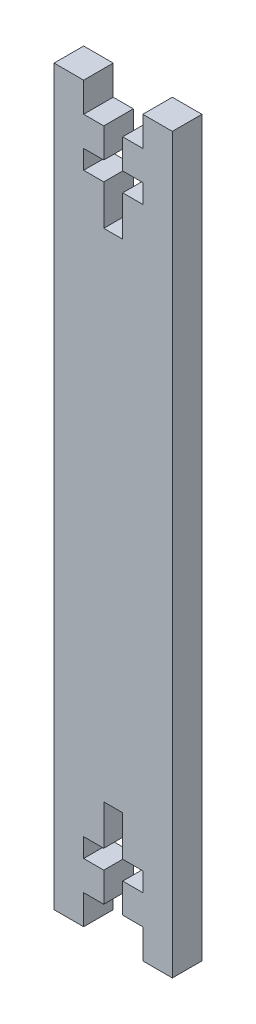
ISO-10303-21;
HEADER;
FILE_DESCRIPTION(('STEP AP214'),'2;1');
FILE_NAME('part.step','',(''),(''),'','','');
FILE_SCHEMA(('AUTOMOTIVE_DESIGN { 1 0 10303 214 1 1 1 1 }'));
ENDSEC;
DATA;
#1=APPLICATION_CONTEXT('core data for automotive mechanical design processes');
#2=APPLICATION_PROTOCOL_DEFINITION('international standard','automotive_design',2000,#1);
#3=PRODUCT_CONTEXT('',#1,'mechanical');
#4=PRODUCT('Part','Part','',(#3));
#5=PRODUCT_RELATED_PRODUCT_CATEGORY('part','',(#4));
#6=PRODUCT_DEFINITION_FORMATION('','',#4);
#7=PRODUCT_DEFINITION_CONTEXT('part definition',#1,'design');
#8=PRODUCT_DEFINITION('design','',#6,#7);
#9=PRODUCT_DEFINITION_SHAPE('','',#8);
#10=(LENGTH_UNIT() NAMED_UNIT(*) SI_UNIT(.MILLI.,.METRE.));
#11=(NAMED_UNIT(*) PLANE_ANGLE_UNIT() SI_UNIT($,.RADIAN.));
#12=(NAMED_UNIT(*) SI_UNIT($,.STERADIAN.) SOLID_ANGLE_UNIT());
#13=UNCERTAINTY_MEASURE_WITH_UNIT(LENGTH_MEASURE(1.E-05),#10,'distance_accuracy_value','');
#14=(GEOMETRIC_REPRESENTATION_CONTEXT(3) GLOBAL_UNCERTAINTY_ASSIGNED_CONTEXT((#13)) GLOBAL_UNIT_ASSIGNED_CONTEXT((#10,
#11,#12)) REPRESENTATION_CONTEXT('',''));
#15=CARTESIAN_POINT('',(0.,0.,0.));
#16=DIRECTION('',(0.,0.,1.));
#17=DIRECTION('',(1.,0.,0.));
#18=AXIS2_PLACEMENT_3D('',#15,#16,#17);
#19=CARTESIAN_POINT('',(12.7,-78.74,6.35));
#20=DIRECTION('',(-1.,0.,0.));
#21=DIRECTION('',(0.,0.,1.));
#22=AXIS2_PLACEMENT_3D('',#19,#20,#21);
#23=PLANE('',#22);
#24=DIRECTION('',(0.,1.,0.));
#25=VECTOR('',#24,1.);
#26=CARTESIAN_POINT('',(12.7,-78.74,0.));
#27=LINE('',#26,#25);
#28=CARTESIAN_POINT('',(12.7,-78.74,0.));
#29=VERTEX_POINT('',#28);
#30=CARTESIAN_POINT('',(12.7,78.74,0.));
#31=VERTEX_POINT('',#30);
#32=EDGE_CURVE('E303',#29,#31,#27,.T.);
#33=ORIENTED_EDGE('',*,*,#32,.T.);
#34=DIRECTION('',(0.,0.,-1.));
#35=VECTOR('',#34,1.);
#36=CARTESIAN_POINT('',(12.7,78.74,6.35));
#37=LINE('',#36,#35);
#38=CARTESIAN_POINT('',(12.7,78.74,6.35));
#39=VERTEX_POINT('',#38);
#40=EDGE_CURVE('E11',#39,#31,#37,.T.);
#41=ORIENTED_EDGE('',*,*,#40,.F.);
#42=DIRECTION('',(0.,1.,0.));
#43=VECTOR('',#42,1.);
#44=CARTESIAN_POINT('',(12.7,-78.74,6.35));
#45=LINE('',#44,#43);
#46=CARTESIAN_POINT('',(12.7,-78.74,6.35));
#47=VERTEX_POINT('',#46);
#48=EDGE_CURVE('E373',#47,#39,#45,.T.);
#49=ORIENTED_EDGE('',*,*,#48,.F.);
#50=DIRECTION('',(0.,0.,-1.));
#51=VECTOR('',#50,1.);
#52=CARTESIAN_POINT('',(12.7,-78.74,6.35));
#53=LINE('',#52,#51);
#54=EDGE_CURVE('E299',#47,#29,#53,.T.);
#55=ORIENTED_EDGE('',*,*,#54,.T.);
#56=EDGE_LOOP('',(#33,#41,#49,#55));
#57=FACE_BOUND('',#56,.T.);
#58=ADVANCED_FACE('F39',(#57),#23,.F.);
#59=CARTESIAN_POINT('',(6.35,78.74,6.35));
#60=DIRECTION('',(0.,-1.,0.));
#61=DIRECTION('',(0.,0.,-1.));
#62=AXIS2_PLACEMENT_3D('',#59,#60,#61);
#63=PLANE('',#62);
#64=DIRECTION('',(-1.,0.,0.));
#65=VECTOR('',#64,1.);
#66=CARTESIAN_POINT('',(6.35,78.74,0.));
#67=LINE('',#66,#65);
#68=CARTESIAN_POINT('',(6.35,78.74,0.));
#69=VERTEX_POINT('',#68);
#70=EDGE_CURVE('E306',#31,#69,#67,.T.);
#71=ORIENTED_EDGE('',*,*,#70,.T.);
#72=DIRECTION('',(0.,0.,-1.));
#73=VECTOR('',#72,1.);
#74=CARTESIAN_POINT('',(6.35,78.74,6.35));
#75=LINE('',#74,#73);
#76=CARTESIAN_POINT('',(6.35,78.74,6.35));
#77=VERTEX_POINT('',#76);
#78=EDGE_CURVE('E47',#77,#69,#75,.T.);
#79=ORIENTED_EDGE('',*,*,#78,.F.);
#80=DIRECTION('',(-1.,0.,0.));
#81=VECTOR('',#80,1.);
#82=CARTESIAN_POINT('',(6.35,78.74,6.35));
#83=LINE('',#82,#81);
#84=EDGE_CURVE('E182',#39,#77,#83,.T.);
#85=ORIENTED_EDGE('',*,*,#84,.F.);
#86=ORIENTED_EDGE('',*,*,#40,.T.);
#87=EDGE_LOOP('',(#71,#79,#85,#86));
#88=FACE_BOUND('',#87,.T.);
#89=ADVANCED_FACE('F571',(#88),#63,.F.);
#90=CARTESIAN_POINT('',(6.35,78.74,6.35));
#91=DIRECTION('',(1.,0.,0.));
#92=DIRECTION('',(0.,0.,-1.));
#93=AXIS2_PLACEMENT_3D('',#90,#91,#92);
#94=PLANE('',#93);
#95=DIRECTION('',(0.,-1.,0.));
#96=VECTOR('',#95,1.);
#97=CARTESIAN_POINT('',(6.35,78.74,0.));
#98=LINE('',#97,#96);
#99=CARTESIAN_POINT('',(6.35,72.39,0.));
#100=VERTEX_POINT('',#99);
#101=EDGE_CURVE('E308',#69,#100,#98,.T.);
#102=ORIENTED_EDGE('',*,*,#101,.T.);
#103=DIRECTION('',(0.,0.,-1.));
#104=VECTOR('',#103,1.);
#105=CARTESIAN_POINT('',(6.35,72.39,6.35));
#106=LINE('',#105,#104);
#107=CARTESIAN_POINT('',(6.35,72.39,6.35));
#108=VERTEX_POINT('',#107);
#109=EDGE_CURVE('E464',#108,#100,#106,.T.);
#110=ORIENTED_EDGE('',*,*,#109,.F.);
#111=DIRECTION('',(0.,-1.,0.));
#112=VECTOR('',#111,1.);
#113=CARTESIAN_POINT('',(6.35,78.74,6.35));
#114=LINE('',#113,#112);
#115=EDGE_CURVE('E472',#77,#108,#114,.T.);
#116=ORIENTED_EDGE('',*,*,#115,.F.);
#117=ORIENTED_EDGE('',*,*,#78,.T.);
#118=EDGE_LOOP('',(#102,#110,#116,#117));
#119=FACE_BOUND('',#118,.T.);
#120=ADVANCED_FACE('F470',(#119),#94,.F.);
#121=CARTESIAN_POINT('',(2.032,72.39,6.35));
#122=DIRECTION('',(0.,-1.,0.));
#123=DIRECTION('',(0.,0.,-1.));
#124=AXIS2_PLACEMENT_3D('',#121,#122,#123);
#125=PLANE('',#124);
#126=DIRECTION('',(-1.,0.,0.));
#127=VECTOR('',#126,1.);
#128=CARTESIAN_POINT('',(2.032,72.39,0.));
#129=LINE('',#128,#127);
#130=CARTESIAN_POINT('',(2.032,72.39,0.));
#131=VERTEX_POINT('',#130);
#132=EDGE_CURVE('E310',#100,#131,#129,.T.);
#133=ORIENTED_EDGE('',*,*,#132,.T.);
#134=DIRECTION('',(0.,0.,-1.));
#135=VECTOR('',#134,1.);
#136=CARTESIAN_POINT('',(2.032,72.39,6.35));
#137=LINE('',#136,#135);
#138=CARTESIAN_POINT('',(2.032,72.39,6.35));
#139=VERTEX_POINT('',#138);
#140=EDGE_CURVE('E461',#139,#131,#137,.T.);
#141=ORIENTED_EDGE('',*,*,#140,.F.);
#142=DIRECTION('',(-1.,0.,0.));
#143=VECTOR('',#142,1.);
#144=CARTESIAN_POINT('',(2.032,72.39,6.35));
#145=LINE('',#144,#143);
#146=EDGE_CURVE('E490',#108,#139,#145,.T.);
#147=ORIENTED_EDGE('',*,*,#146,.F.);
#148=ORIENTED_EDGE('',*,*,#109,.T.);
#149=EDGE_LOOP('',(#133,#141,#147,#148));
#150=FACE_BOUND('',#149,.T.);
#151=ADVANCED_FACE('F481',(#150),#125,.F.);
#152=CARTESIAN_POINT('',(2.032,72.39,6.35));
#153=DIRECTION('',(1.,0.,0.));
#154=DIRECTION('',(0.,0.,-1.));
#155=AXIS2_PLACEMENT_3D('',#152,#153,#154);
#156=PLANE('',#155);
#157=DIRECTION('',(0.,-1.,0.));
#158=VECTOR('',#157,1.);
#159=CARTESIAN_POINT('',(2.032,72.39,0.));
#160=LINE('',#159,#158);
#161=CARTESIAN_POINT('',(2.032,66.04,0.));
#162=VERTEX_POINT('',#161);
#163=EDGE_CURVE('E312',#131,#162,#160,.T.);
#164=ORIENTED_EDGE('',*,*,#163,.T.);
#165=DIRECTION('',(0.,0.,-1.));
#166=VECTOR('',#165,1.);
#167=CARTESIAN_POINT('',(2.032,66.04,6.35));
#168=LINE('',#167,#166);
#169=CARTESIAN_POINT('',(2.032,66.04,6.35));
#170=VERTEX_POINT('',#169);
#171=EDGE_CURVE('E458',#170,#162,#168,.T.);
#172=ORIENTED_EDGE('',*,*,#171,.F.);
#173=DIRECTION('',(0.,-1.,0.));
#174=VECTOR('',#173,1.);
#175=CARTESIAN_POINT('',(2.032,72.39,6.35));
#176=LINE('',#175,#174);
#177=EDGE_CURVE('E487',#139,#170,#176,.T.);
#178=ORIENTED_EDGE('',*,*,#177,.F.);
#179=ORIENTED_EDGE('',*,*,#140,.T.);
#180=EDGE_LOOP('',(#164,#172,#178,#179));
#181=FACE_BOUND('',#180,.T.);
#182=ADVANCED_FACE('F485',(#181),#156,.F.);
#183=CARTESIAN_POINT('',(2.032,66.04,6.35));
#184=DIRECTION('',(0.,1.,0.));
#185=DIRECTION('',(0.,0.,1.));
#186=AXIS2_PLACEMENT_3D('',#183,#184,#185);
#187=PLANE('',#186);
#188=DIRECTION('',(1.,0.,0.));
#189=VECTOR('',#188,1.);
#190=CARTESIAN_POINT('',(2.032,66.04,0.));
#191=LINE('',#190,#189);
#192=CARTESIAN_POINT('',(6.35,66.04,0.));
#193=VERTEX_POINT('',#192);
#194=EDGE_CURVE('E314',#162,#193,#191,.T.);
#195=ORIENTED_EDGE('',*,*,#194,.T.);
#196=DIRECTION('',(0.,0.,-1.));
#197=VECTOR('',#196,1.);
#198=CARTESIAN_POINT('',(6.35,66.04,6.35));
#199=LINE('',#198,#197);
#200=CARTESIAN_POINT('',(6.35,66.04,6.35));
#201=VERTEX_POINT('',#200);
#202=EDGE_CURVE('E455',#201,#193,#199,.T.);
#203=ORIENTED_EDGE('',*,*,#202,.F.);
#204=DIRECTION('',(1.,0.,0.));
#205=VECTOR('',#204,1.);
#206=CARTESIAN_POINT('',(2.032,66.04,6.35));
#207=LINE('',#206,#205);
#208=EDGE_CURVE('E489',#170,#201,#207,.T.);
#209=ORIENTED_EDGE('',*,*,#208,.F.);
#210=ORIENTED_EDGE('',*,*,#171,.T.);
#211=EDGE_LOOP('',(#195,#203,#209,#210));
#212=FACE_BOUND('',#211,.T.);
#213=ADVANCED_FACE('F584',(#212),#187,.F.);
#214=CARTESIAN_POINT('',(6.35,66.04,6.35));
#215=DIRECTION('',(1.,0.,0.));
#216=DIRECTION('',(0.,1.,0.));
#217=AXIS2_PLACEMENT_3D('',#214,#215,#216);
#218=PLANE('',#217);
#219=DIRECTION('',(0.,-1.,0.));
#220=VECTOR('',#219,1.);
#221=CARTESIAN_POINT('',(6.35,66.04,0.));
#222=LINE('',#221,#220);
#223=CARTESIAN_POINT('',(6.35,61.976,0.));
#224=VERTEX_POINT('',#223);
#225=EDGE_CURVE('E316',#193,#224,#222,.T.);
#226=ORIENTED_EDGE('',*,*,#225,.T.);
#227=DIRECTION('',(0.,0.,-1.));
#228=VECTOR('',#227,1.);
#229=CARTESIAN_POINT('',(6.35,61.976,6.35));
#230=LINE('',#229,#228);
#231=CARTESIAN_POINT('',(6.35,61.976,6.35));
#232=VERTEX_POINT('',#231);
#233=EDGE_CURVE('E452',#232,#224,#230,.T.);
#234=ORIENTED_EDGE('',*,*,#233,.F.);
#235=DIRECTION('',(0.,-1.,0.));
#236=VECTOR('',#235,1.);
#237=CARTESIAN_POINT('',(6.35,66.04,6.35));
#238=LINE('',#237,#236);
#239=EDGE_CURVE('E492',#201,#232,#238,.T.);
#240=ORIENTED_EDGE('',*,*,#239,.F.);
#241=ORIENTED_EDGE('',*,*,#202,.T.);
#242=EDGE_LOOP('',(#226,#234,#240,#241));
#243=FACE_BOUND('',#242,.T.);
#244=ADVANCED_FACE('F587',(#243),#218,.F.);
#245=CARTESIAN_POINT('',(2.032,61.976,6.35));
#246=DIRECTION('',(0.,-1.,0.));
#247=DIRECTION('',(0.,0.,-1.));
#248=AXIS2_PLACEMENT_3D('',#245,#246,#247);
#249=PLANE('',#248);
#250=DIRECTION('',(-1.,0.,0.));
#251=VECTOR('',#250,1.);
#252=CARTESIAN_POINT('',(2.032,61.976,0.));
#253=LINE('',#252,#251);
#254=CARTESIAN_POINT('',(2.032,61.976,0.));
#255=VERTEX_POINT('',#254);
#256=EDGE_CURVE('E318',#224,#255,#253,.T.);
#257=ORIENTED_EDGE('',*,*,#256,.T.);
#258=DIRECTION('',(0.,0.,-1.));
#259=VECTOR('',#258,1.);
#260=CARTESIAN_POINT('',(2.032,61.976,6.35));
#261=LINE('',#260,#259);
#262=CARTESIAN_POINT('',(2.032,61.976,6.35));
#263=VERTEX_POINT('',#262);
#264=EDGE_CURVE('E449',#263,#255,#261,.T.);
#265=ORIENTED_EDGE('',*,*,#264,.F.);
#266=DIRECTION('',(-1.,0.,0.));
#267=VECTOR('',#266,1.);
#268=CARTESIAN_POINT('',(2.032,61.976,6.35));
#269=LINE('',#268,#267);
#270=EDGE_CURVE('E498',#232,#263,#269,.T.);
#271=ORIENTED_EDGE('',*,*,#270,.F.);
#272=ORIENTED_EDGE('',*,*,#233,.T.);
#273=EDGE_LOOP('',(#257,#265,#271,#272));
#274=FACE_BOUND('',#273,.T.);
#275=ADVANCED_FACE('F591',(#274),#249,.F.);
#276=CARTESIAN_POINT('',(2.032,61.976,6.35));
#277=DIRECTION('',(1.,0.,0.));
#278=DIRECTION('',(0.,1.,0.));
#279=AXIS2_PLACEMENT_3D('',#276,#277,#278);
#280=PLANE('',#279);
#281=DIRECTION('',(0.,-1.,0.));
#282=VECTOR('',#281,1.);
#283=CARTESIAN_POINT('',(2.032,61.976,0.));
#284=LINE('',#283,#282);
#285=CARTESIAN_POINT('',(2.032,53.34,0.));
#286=VERTEX_POINT('',#285);
#287=EDGE_CURVE('E320',#255,#286,#284,.T.);
#288=ORIENTED_EDGE('',*,*,#287,.T.);
#289=DIRECTION('',(0.,0.,-1.));
#290=VECTOR('',#289,1.);
#291=CARTESIAN_POINT('',(2.032,53.34,6.35));
#292=LINE('',#291,#290);
#293=CARTESIAN_POINT('',(2.032,53.34,6.35));
#294=VERTEX_POINT('',#293);
#295=EDGE_CURVE('E446',#294,#286,#292,.T.);
#296=ORIENTED_EDGE('',*,*,#295,.F.);
#297=DIRECTION('',(0.,-1.,0.));
#298=VECTOR('',#297,1.);
#299=CARTESIAN_POINT('',(2.032,61.976,6.35));
#300=LINE('',#299,#298);
#301=EDGE_CURVE('E500',#263,#294,#300,.T.);
#302=ORIENTED_EDGE('',*,*,#301,.F.);
#303=ORIENTED_EDGE('',*,*,#264,.T.);
#304=EDGE_LOOP('',(#288,#296,#302,#303));
#305=FACE_BOUND('',#304,.T.);
#306=ADVANCED_FACE('F595',(#305),#280,.F.);
#307=CARTESIAN_POINT('',(-2.032,53.34,6.35));
#308=DIRECTION('',(0.,-1.,0.));
#309=DIRECTION('',(0.,0.,-1.));
#310=AXIS2_PLACEMENT_3D('',#307,#308,#309);
#311=PLANE('',#310);
#312=DIRECTION('',(-1.,0.,0.));
#313=VECTOR('',#312,1.);
#314=CARTESIAN_POINT('',(-2.032,53.34,0.));
#315=LINE('',#314,#313);
#316=CARTESIAN_POINT('',(-2.032,53.34,0.));
#317=VERTEX_POINT('',#316);
#318=EDGE_CURVE('E322',#286,#317,#315,.T.);
#319=ORIENTED_EDGE('',*,*,#318,.T.);
#320=DIRECTION('',(0.,0.,-1.));
#321=VECTOR('',#320,1.);
#322=CARTESIAN_POINT('',(-2.032,53.34,6.35));
#323=LINE('',#322,#321);
#324=CARTESIAN_POINT('',(-2.032,53.34,6.35));
#325=VERTEX_POINT('',#324);
#326=EDGE_CURVE('E443',#325,#317,#323,.T.);
#327=ORIENTED_EDGE('',*,*,#326,.F.);
#328=DIRECTION('',(-1.,0.,0.));
#329=VECTOR('',#328,1.);
#330=CARTESIAN_POINT('',(-2.032,53.34,6.35));
#331=LINE('',#330,#329);
#332=EDGE_CURVE('E502',#294,#325,#331,.T.);
#333=ORIENTED_EDGE('',*,*,#332,.F.);
#334=ORIENTED_EDGE('',*,*,#295,.T.);
#335=EDGE_LOOP('',(#319,#327,#333,#334));
#336=FACE_BOUND('',#335,.T.);
#337=ADVANCED_FACE('F599',(#336),#311,.F.);
#338=CARTESIAN_POINT('',(-2.032,61.976,6.35));
#339=DIRECTION('',(-1.,0.,0.));
#340=DIRECTION('',(0.,0.,1.));
#341=AXIS2_PLACEMENT_3D('',#338,#339,#340);
#342=PLANE('',#341);
#343=DIRECTION('',(0.,1.,0.));
#344=VECTOR('',#343,1.);
#345=CARTESIAN_POINT('',(-2.032,61.976,0.));
#346=LINE('',#345,#344);
#347=CARTESIAN_POINT('',(-2.032,61.976,0.));
#348=VERTEX_POINT('',#347);
#349=EDGE_CURVE('E324',#317,#348,#346,.T.);
#350=ORIENTED_EDGE('',*,*,#349,.T.);
#351=DIRECTION('',(0.,0.,-1.));
#352=VECTOR('',#351,1.);
#353=CARTESIAN_POINT('',(-2.032,61.976,6.35));
#354=LINE('',#353,#352);
#355=CARTESIAN_POINT('',(-2.032,61.976,6.35));
#356=VERTEX_POINT('',#355);
#357=EDGE_CURVE('E440',#356,#348,#354,.T.);
#358=ORIENTED_EDGE('',*,*,#357,.F.);
#359=DIRECTION('',(0.,1.,0.));
#360=VECTOR('',#359,1.);
#361=CARTESIAN_POINT('',(-2.032,61.976,6.35));
#362=LINE('',#361,#360);
#363=EDGE_CURVE('E504',#325,#356,#362,.T.);
#364=ORIENTED_EDGE('',*,*,#363,.F.);
#365=ORIENTED_EDGE('',*,*,#326,.T.);
#366=EDGE_LOOP('',(#350,#358,#364,#365));
#367=FACE_BOUND('',#366,.T.);
#368=ADVANCED_FACE('F603',(#367),#342,.F.);
#369=CARTESIAN_POINT('',(-2.032,61.976,6.35));
#370=DIRECTION('',(0.,-1.,0.));
#371=DIRECTION('',(0.,0.,-1.));
#372=AXIS2_PLACEMENT_3D('',#369,#370,#371);
#373=PLANE('',#372);
#374=DIRECTION('',(-1.,0.,0.));
#375=VECTOR('',#374,1.);
#376=CARTESIAN_POINT('',(-2.032,61.976,0.));
#377=LINE('',#376,#375);
#378=CARTESIAN_POINT('',(-6.35,61.976,0.));
#379=VERTEX_POINT('',#378);
#380=EDGE_CURVE('E326',#348,#379,#377,.T.);
#381=ORIENTED_EDGE('',*,*,#380,.T.);
#382=DIRECTION('',(0.,0.,-1.));
#383=VECTOR('',#382,1.);
#384=CARTESIAN_POINT('',(-6.35,61.976,6.35));
#385=LINE('',#384,#383);
#386=CARTESIAN_POINT('',(-6.35,61.976,6.35));
#387=VERTEX_POINT('',#386);
#388=EDGE_CURVE('E437',#387,#379,#385,.T.);
#389=ORIENTED_EDGE('',*,*,#388,.F.);
#390=DIRECTION('',(-1.,0.,0.));
#391=VECTOR('',#390,1.);
#392=CARTESIAN_POINT('',(-2.032,61.976,6.35));
#393=LINE('',#392,#391);
#394=EDGE_CURVE('E506',#356,#387,#393,.T.);
#395=ORIENTED_EDGE('',*,*,#394,.F.);
#396=ORIENTED_EDGE('',*,*,#357,.T.);
#397=EDGE_LOOP('',(#381,#389,#395,#396));
#398=FACE_BOUND('',#397,.T.);
#399=ADVANCED_FACE('F607',(#398),#373,.F.);
#400=CARTESIAN_POINT('',(-6.35,66.04,6.35));
#401=DIRECTION('',(-1.,0.,0.));
#402=DIRECTION('',(0.,-1.,0.));
#403=AXIS2_PLACEMENT_3D('',#400,#401,#402);
#404=PLANE('',#403);
#405=DIRECTION('',(0.,1.,0.));
#406=VECTOR('',#405,1.);
#407=CARTESIAN_POINT('',(-6.35,66.04,0.));
#408=LINE('',#407,#406);
#409=CARTESIAN_POINT('',(-6.35,66.04,0.));
#410=VERTEX_POINT('',#409);
#411=EDGE_CURVE('E328',#379,#410,#408,.T.);
#412=ORIENTED_EDGE('',*,*,#411,.T.);
#413=DIRECTION('',(0.,0.,-1.));
#414=VECTOR('',#413,1.);
#415=CARTESIAN_POINT('',(-6.35,66.04,6.35));
#416=LINE('',#415,#414);
#417=CARTESIAN_POINT('',(-6.35,66.04,6.35));
#418=VERTEX_POINT('',#417);
#419=EDGE_CURVE('E434',#418,#410,#416,.T.);
#420=ORIENTED_EDGE('',*,*,#419,.F.);
#421=DIRECTION('',(0.,1.,0.));
#422=VECTOR('',#421,1.);
#423=CARTESIAN_POINT('',(-6.35,66.04,6.35));
#424=LINE('',#423,#422);
#425=EDGE_CURVE('E508',#387,#418,#424,.T.);
#426=ORIENTED_EDGE('',*,*,#425,.F.);
#427=ORIENTED_EDGE('',*,*,#388,.T.);
#428=EDGE_LOOP('',(#412,#420,#426,#427));
#429=FACE_BOUND('',#428,.T.);
#430=ADVANCED_FACE('F611',(#429),#404,.F.);
#431=CARTESIAN_POINT('',(-2.032,66.04,6.35));
#432=DIRECTION('',(0.,1.,0.));
#433=DIRECTION('',(0.,0.,1.));
#434=AXIS2_PLACEMENT_3D('',#431,#432,#433);
#435=PLANE('',#434);
#436=DIRECTION('',(1.,0.,0.));
#437=VECTOR('',#436,1.);
#438=CARTESIAN_POINT('',(-2.032,66.04,0.));
#439=LINE('',#438,#437);
#440=CARTESIAN_POINT('',(-2.032,66.04,0.));
#441=VERTEX_POINT('',#440);
#442=EDGE_CURVE('E330',#410,#441,#439,.T.);
#443=ORIENTED_EDGE('',*,*,#442,.T.);
#444=DIRECTION('',(0.,0.,-1.));
#445=VECTOR('',#444,1.);
#446=CARTESIAN_POINT('',(-2.032,66.04,6.35));
#447=LINE('',#446,#445);
#448=CARTESIAN_POINT('',(-2.032,66.04,6.35));
#449=VERTEX_POINT('',#448);
#450=EDGE_CURVE('E431',#449,#441,#447,.T.);
#451=ORIENTED_EDGE('',*,*,#450,.F.);
#452=DIRECTION('',(1.,0.,0.));
#453=VECTOR('',#452,1.);
#454=CARTESIAN_POINT('',(-2.032,66.04,6.35));
#455=LINE('',#454,#453);
#456=EDGE_CURVE('E510',#418,#449,#455,.T.);
#457=ORIENTED_EDGE('',*,*,#456,.F.);
#458=ORIENTED_EDGE('',*,*,#419,.T.);
#459=EDGE_LOOP('',(#443,#451,#457,#458));
#460=FACE_BOUND('',#459,.T.);
#461=ADVANCED_FACE('F615',(#460),#435,.F.);
#462=CARTESIAN_POINT('',(-2.032,72.39,6.35));
#463=DIRECTION('',(-1.,0.,0.));
#464=DIRECTION('',(0.,0.,1.));
#465=AXIS2_PLACEMENT_3D('',#462,#463,#464);
#466=PLANE('',#465);
#467=DIRECTION('',(0.,1.,0.));
#468=VECTOR('',#467,1.);
#469=CARTESIAN_POINT('',(-2.032,72.39,0.));
#470=LINE('',#469,#468);
#471=CARTESIAN_POINT('',(-2.032,72.39,0.));
#472=VERTEX_POINT('',#471);
#473=EDGE_CURVE('E332',#441,#472,#470,.T.);
#474=ORIENTED_EDGE('',*,*,#473,.T.);
#475=DIRECTION('',(0.,0.,-1.));
#476=VECTOR('',#475,1.);
#477=CARTESIAN_POINT('',(-2.032,72.39,6.35));
#478=LINE('',#477,#476);
#479=CARTESIAN_POINT('',(-2.032,72.39,6.35));
#480=VERTEX_POINT('',#479);
#481=EDGE_CURVE('E428',#480,#472,#478,.T.);
#482=ORIENTED_EDGE('',*,*,#481,.F.);
#483=DIRECTION('',(0.,1.,0.));
#484=VECTOR('',#483,1.);
#485=CARTESIAN_POINT('',(-2.032,72.39,6.35));
#486=LINE('',#485,#484);
#487=EDGE_CURVE('E512',#449,#480,#486,.T.);
#488=ORIENTED_EDGE('',*,*,#487,.F.);
#489=ORIENTED_EDGE('',*,*,#450,.T.);
#490=EDGE_LOOP('',(#474,#482,#488,#489));
#491=FACE_BOUND('',#490,.T.);
#492=ADVANCED_FACE('F619',(#491),#466,.F.);
#493=CARTESIAN_POINT('',(-6.35,72.39,6.35));
#494=DIRECTION('',(0.,-1.,0.));
#495=DIRECTION('',(0.,0.,-1.));
#496=AXIS2_PLACEMENT_3D('',#493,#494,#495);
#497=PLANE('',#496);
#498=DIRECTION('',(-1.,0.,0.));
#499=VECTOR('',#498,1.);
#500=CARTESIAN_POINT('',(-6.35,72.39,0.));
#501=LINE('',#500,#499);
#502=CARTESIAN_POINT('',(-6.35,72.39,0.));
#503=VERTEX_POINT('',#502);
#504=EDGE_CURVE('E334',#472,#503,#501,.T.);
#505=ORIENTED_EDGE('',*,*,#504,.T.);
#506=DIRECTION('',(0.,0.,-1.));
#507=VECTOR('',#506,1.);
#508=CARTESIAN_POINT('',(-6.35,72.39,6.35));
#509=LINE('',#508,#507);
#510=CARTESIAN_POINT('',(-6.35,72.39,6.35));
#511=VERTEX_POINT('',#510);
#512=EDGE_CURVE('E425',#511,#503,#509,.T.);
#513=ORIENTED_EDGE('',*,*,#512,.F.);
#514=DIRECTION('',(-1.,0.,0.));
#515=VECTOR('',#514,1.);
#516=CARTESIAN_POINT('',(-6.35,72.39,6.35));
#517=LINE('',#516,#515);
#518=EDGE_CURVE('E514',#480,#511,#517,.T.);
#519=ORIENTED_EDGE('',*,*,#518,.F.);
#520=ORIENTED_EDGE('',*,*,#481,.T.);
#521=EDGE_LOOP('',(#505,#513,#519,#520));
#522=FACE_BOUND('',#521,.T.);
#523=ADVANCED_FACE('F623',(#522),#497,.F.);
#524=CARTESIAN_POINT('',(-6.35,78.74,6.35));
#525=DIRECTION('',(-1.,0.,0.));
#526=DIRECTION('',(0.,0.,1.));
#527=AXIS2_PLACEMENT_3D('',#524,#525,#526);
#528=PLANE('',#527);
#529=DIRECTION('',(0.,1.,0.));
#530=VECTOR('',#529,1.);
#531=CARTESIAN_POINT('',(-6.35,78.74,0.));
#532=LINE('',#531,#530);
#533=CARTESIAN_POINT('',(-6.35,78.74,0.));
#534=VERTEX_POINT('',#533);
#535=EDGE_CURVE('E336',#503,#534,#532,.T.);
#536=ORIENTED_EDGE('',*,*,#535,.T.);
#537=DIRECTION('',(0.,0.,-1.));
#538=VECTOR('',#537,1.);
#539=CARTESIAN_POINT('',(-6.35,78.74,6.35));
#540=LINE('',#539,#538);
#541=CARTESIAN_POINT('',(-6.35,78.74,6.35));
#542=VERTEX_POINT('',#541);
#543=EDGE_CURVE('E422',#542,#534,#540,.T.);
#544=ORIENTED_EDGE('',*,*,#543,.F.);
#545=DIRECTION('',(0.,1.,0.));
#546=VECTOR('',#545,1.);
#547=CARTESIAN_POINT('',(-6.35,78.74,6.35));
#548=LINE('',#547,#546);
#549=EDGE_CURVE('E516',#511,#542,#548,.T.);
#550=ORIENTED_EDGE('',*,*,#549,.F.);
#551=ORIENTED_EDGE('',*,*,#512,.T.);
#552=EDGE_LOOP('',(#536,#544,#550,#551));
#553=FACE_BOUND('',#552,.T.);
#554=ADVANCED_FACE('F627',(#553),#528,.F.);
#555=CARTESIAN_POINT('',(-12.7,78.74,6.35));
#556=DIRECTION('',(0.,-1.,0.));
#557=DIRECTION('',(0.,0.,-1.));
#558=AXIS2_PLACEMENT_3D('',#555,#556,#557);
#559=PLANE('',#558);
#560=DIRECTION('',(-1.,0.,0.));
#561=VECTOR('',#560,1.);
#562=CARTESIAN_POINT('',(-12.7,78.74,0.));
#563=LINE('',#562,#561);
#564=CARTESIAN_POINT('',(-12.7,78.74,0.));
#565=VERTEX_POINT('',#564);
#566=EDGE_CURVE('E338',#534,#565,#563,.T.);
#567=ORIENTED_EDGE('',*,*,#566,.T.);
#568=DIRECTION('',(0.,0.,-1.));
#569=VECTOR('',#568,1.);
#570=CARTESIAN_POINT('',(-12.7,78.74,6.35));
#571=LINE('',#570,#569);
#572=CARTESIAN_POINT('',(-12.7,78.74,6.35));
#573=VERTEX_POINT('',#572);
#574=EDGE_CURVE('E419',#573,#565,#571,.T.);
#575=ORIENTED_EDGE('',*,*,#574,.F.);
#576=DIRECTION('',(-1.,0.,0.));
#577=VECTOR('',#576,1.);
#578=CARTESIAN_POINT('',(-12.7,78.74,6.35));
#579=LINE('',#578,#577);
#580=EDGE_CURVE('E518',#542,#573,#579,.T.);
#581=ORIENTED_EDGE('',*,*,#580,.F.);
#582=ORIENTED_EDGE('',*,*,#543,.T.);
#583=EDGE_LOOP('',(#567,#575,#581,#582));
#584=FACE_BOUND('',#583,.T.);
#585=ADVANCED_FACE('F631',(#584),#559,.F.);
#586=CARTESIAN_POINT('',(-12.7,-78.74,6.35));
#587=DIRECTION('',(1.,0.,0.));
#588=DIRECTION('',(0.,0.,-1.));
#589=AXIS2_PLACEMENT_3D('',#586,#587,#588);
#590=PLANE('',#589);
#591=DIRECTION('',(0.,-1.,0.));
#592=VECTOR('',#591,1.);
#593=CARTESIAN_POINT('',(-12.7,-78.74,0.));
#594=LINE('',#593,#592);
#595=CARTESIAN_POINT('',(-12.7,-78.74,0.));
#596=VERTEX_POINT('',#595);
#597=EDGE_CURVE('E340',#565,#596,#594,.T.);
#598=ORIENTED_EDGE('',*,*,#597,.T.);
#599=DIRECTION('',(0.,0.,-1.));
#600=VECTOR('',#599,1.);
#601=CARTESIAN_POINT('',(-12.7,-78.74,6.35));
#602=LINE('',#601,#600);
#603=CARTESIAN_POINT('',(-12.7,-78.74,6.35));
#604=VERTEX_POINT('',#603);
#605=EDGE_CURVE('E416',#604,#596,#602,.T.);
#606=ORIENTED_EDGE('',*,*,#605,.F.);
#607=DIRECTION('',(0.,-1.,0.));
#608=VECTOR('',#607,1.);
#609=CARTESIAN_POINT('',(-12.7,-78.74,6.35));
#610=LINE('',#609,#608);
#611=EDGE_CURVE('E520',#573,#604,#610,.T.);
#612=ORIENTED_EDGE('',*,*,#611,.F.);
#613=ORIENTED_EDGE('',*,*,#574,.T.);
#614=EDGE_LOOP('',(#598,#606,#612,#613));
#615=FACE_BOUND('',#614,.T.);
#616=ADVANCED_FACE('F635',(#615),#590,.F.);
#617=CARTESIAN_POINT('',(-12.7,-78.74,6.35));
#618=DIRECTION('',(0.,1.,0.));
#619=DIRECTION('',(0.,0.,1.));
#620=AXIS2_PLACEMENT_3D('',#617,#618,#619);
#621=PLANE('',#620);
#622=DIRECTION('',(1.,0.,0.));
#623=VECTOR('',#622,1.);
#624=CARTESIAN_POINT('',(-12.7,-78.74,0.));
#625=LINE('',#624,#623);
#626=CARTESIAN_POINT('',(-6.35,-78.74,0.));
#627=VERTEX_POINT('',#626);
#628=EDGE_CURVE('E342',#596,#627,#625,.T.);
#629=ORIENTED_EDGE('',*,*,#628,.T.);
#630=DIRECTION('',(0.,0.,-1.));
#631=VECTOR('',#630,1.);
#632=CARTESIAN_POINT('',(-6.35,-78.74,6.35));
#633=LINE('',#632,#631);
#634=CARTESIAN_POINT('',(-6.35,-78.74,6.35));
#635=VERTEX_POINT('',#634);
#636=EDGE_CURVE('E413',#635,#627,#633,.T.);
#637=ORIENTED_EDGE('',*,*,#636,.F.);
#638=DIRECTION('',(1.,0.,0.));
#639=VECTOR('',#638,1.);
#640=CARTESIAN_POINT('',(-12.7,-78.74,6.35));
#641=LINE('',#640,#639);
#642=EDGE_CURVE('E522',#604,#635,#641,.T.);
#643=ORIENTED_EDGE('',*,*,#642,.F.);
#644=ORIENTED_EDGE('',*,*,#605,.T.);
#645=EDGE_LOOP('',(#629,#637,#643,#644));
#646=FACE_BOUND('',#645,.T.);
#647=ADVANCED_FACE('F639',(#646),#621,.F.);
#648=CARTESIAN_POINT('',(-6.35,-78.74,6.35));
#649=DIRECTION('',(-1.,0.,0.));
#650=DIRECTION('',(0.,0.,1.));
#651=AXIS2_PLACEMENT_3D('',#648,#649,#650);
#652=PLANE('',#651);
#653=DIRECTION('',(0.,1.,0.));
#654=VECTOR('',#653,1.);
#655=CARTESIAN_POINT('',(-6.35,-78.74,0.));
#656=LINE('',#655,#654);
#657=CARTESIAN_POINT('',(-6.35,-72.39,0.));
#658=VERTEX_POINT('',#657);
#659=EDGE_CURVE('E344',#627,#658,#656,.T.);
#660=ORIENTED_EDGE('',*,*,#659,.T.);
#661=DIRECTION('',(0.,0.,-1.));
#662=VECTOR('',#661,1.);
#663=CARTESIAN_POINT('',(-6.35,-72.39,6.35));
#664=LINE('',#663,#662);
#665=CARTESIAN_POINT('',(-6.35,-72.39,6.35));
#666=VERTEX_POINT('',#665);
#667=EDGE_CURVE('E410',#666,#658,#664,.T.);
#668=ORIENTED_EDGE('',*,*,#667,.F.);
#669=DIRECTION('',(0.,1.,0.));
#670=VECTOR('',#669,1.);
#671=CARTESIAN_POINT('',(-6.35,-78.74,6.35));
#672=LINE('',#671,#670);
#673=EDGE_CURVE('E524',#635,#666,#672,.T.);
#674=ORIENTED_EDGE('',*,*,#673,.F.);
#675=ORIENTED_EDGE('',*,*,#636,.T.);
#676=EDGE_LOOP('',(#660,#668,#674,#675));
#677=FACE_BOUND('',#676,.T.);
#678=ADVANCED_FACE('F643',(#677),#652,.F.);
#679=CARTESIAN_POINT('',(-6.35,-72.39,6.35));
#680=DIRECTION('',(0.,1.,0.));
#681=DIRECTION('',(0.,0.,1.));
#682=AXIS2_PLACEMENT_3D('',#679,#680,#681);
#683=PLANE('',#682);
#684=DIRECTION('',(1.,0.,0.));
#685=VECTOR('',#684,1.);
#686=CARTESIAN_POINT('',(-6.35,-72.39,0.));
#687=LINE('',#686,#685);
#688=CARTESIAN_POINT('',(-2.032,-72.39,0.));
#689=VERTEX_POINT('',#688);
#690=EDGE_CURVE('E346',#658,#689,#687,.T.);
#691=ORIENTED_EDGE('',*,*,#690,.T.);
#692=DIRECTION('',(0.,0.,-1.));
#693=VECTOR('',#692,1.);
#694=CARTESIAN_POINT('',(-2.032,-72.39,6.35));
#695=LINE('',#694,#693);
#696=CARTESIAN_POINT('',(-2.032,-72.39,6.35));
#697=VERTEX_POINT('',#696);
#698=EDGE_CURVE('E407',#697,#689,#695,.T.);
#699=ORIENTED_EDGE('',*,*,#698,.F.);
#700=DIRECTION('',(1.,0.,0.));
#701=VECTOR('',#700,1.);
#702=CARTESIAN_POINT('',(-6.35,-72.39,6.35));
#703=LINE('',#702,#701);
#704=EDGE_CURVE('E526',#666,#697,#703,.T.);
#705=ORIENTED_EDGE('',*,*,#704,.F.);
#706=ORIENTED_EDGE('',*,*,#667,.T.);
#707=EDGE_LOOP('',(#691,#699,#705,#706));
#708=FACE_BOUND('',#707,.T.);
#709=ADVANCED_FACE('F647',(#708),#683,.F.);
#710=CARTESIAN_POINT('',(-2.032,-72.39,6.35));
#711=DIRECTION('',(-1.,0.,0.));
#712=DIRECTION('',(0.,0.,1.));
#713=AXIS2_PLACEMENT_3D('',#710,#711,#712);
#714=PLANE('',#713);
#715=DIRECTION('',(0.,1.,0.));
#716=VECTOR('',#715,1.);
#717=CARTESIAN_POINT('',(-2.032,-72.39,0.));
#718=LINE('',#717,#716);
#719=CARTESIAN_POINT('',(-2.032,-66.04,0.));
#720=VERTEX_POINT('',#719);
#721=EDGE_CURVE('E348',#689,#720,#718,.T.);
#722=ORIENTED_EDGE('',*,*,#721,.T.);
#723=DIRECTION('',(0.,0.,-1.));
#724=VECTOR('',#723,1.);
#725=CARTESIAN_POINT('',(-2.032,-66.04,6.35));
#726=LINE('',#725,#724);
#727=CARTESIAN_POINT('',(-2.032,-66.04,6.35));
#728=VERTEX_POINT('',#727);
#729=EDGE_CURVE('E404',#728,#720,#726,.T.);
#730=ORIENTED_EDGE('',*,*,#729,.F.);
#731=DIRECTION('',(0.,1.,0.));
#732=VECTOR('',#731,1.);
#733=CARTESIAN_POINT('',(-2.032,-72.39,6.35));
#734=LINE('',#733,#732);
#735=EDGE_CURVE('E528',#697,#728,#734,.T.);
#736=ORIENTED_EDGE('',*,*,#735,.F.);
#737=ORIENTED_EDGE('',*,*,#698,.T.);
#738=EDGE_LOOP('',(#722,#730,#736,#737));
#739=FACE_BOUND('',#738,.T.);
#740=ADVANCED_FACE('F651',(#739),#714,.F.);
#741=CARTESIAN_POINT('',(-6.35,-66.04,6.35));
#742=DIRECTION('',(0.,-1.,0.));
#743=DIRECTION('',(0.,0.,-1.));
#744=AXIS2_PLACEMENT_3D('',#741,#742,#743);
#745=PLANE('',#744);
#746=DIRECTION('',(-1.,0.,0.));
#747=VECTOR('',#746,1.);
#748=CARTESIAN_POINT('',(-6.35,-66.04,0.));
#749=LINE('',#748,#747);
#750=CARTESIAN_POINT('',(-6.35,-66.04,0.));
#751=VERTEX_POINT('',#750);
#752=EDGE_CURVE('E350',#720,#751,#749,.T.);
#753=ORIENTED_EDGE('',*,*,#752,.T.);
#754=DIRECTION('',(0.,0.,-1.));
#755=VECTOR('',#754,1.);
#756=CARTESIAN_POINT('',(-6.35,-66.04,6.35));
#757=LINE('',#756,#755);
#758=CARTESIAN_POINT('',(-6.35,-66.04,6.35));
#759=VERTEX_POINT('',#758);
#760=EDGE_CURVE('E401',#759,#751,#757,.T.);
#761=ORIENTED_EDGE('',*,*,#760,.F.);
#762=DIRECTION('',(-1.,0.,0.));
#763=VECTOR('',#762,1.);
#764=CARTESIAN_POINT('',(-6.35,-66.04,6.35));
#765=LINE('',#764,#763);
#766=EDGE_CURVE('E530',#728,#759,#765,.T.);
#767=ORIENTED_EDGE('',*,*,#766,.F.);
#768=ORIENTED_EDGE('',*,*,#729,.T.);
#769=EDGE_LOOP('',(#753,#761,#767,#768));
#770=FACE_BOUND('',#769,.T.);
#771=ADVANCED_FACE('F655',(#770),#745,.F.);
#772=CARTESIAN_POINT('',(-6.35,-66.04,6.35));
#773=DIRECTION('',(-1.,0.,0.));
#774=DIRECTION('',(0.,0.,1.));
#775=AXIS2_PLACEMENT_3D('',#772,#773,#774);
#776=PLANE('',#775);
#777=DIRECTION('',(0.,1.,0.));
#778=VECTOR('',#777,1.);
#779=CARTESIAN_POINT('',(-6.35,-66.04,0.));
#780=LINE('',#779,#778);
#781=CARTESIAN_POINT('',(-6.35,-61.976,0.));
#782=VERTEX_POINT('',#781);
#783=EDGE_CURVE('E352',#751,#782,#780,.T.);
#784=ORIENTED_EDGE('',*,*,#783,.T.);
#785=DIRECTION('',(0.,0.,-1.));
#786=VECTOR('',#785,1.);
#787=CARTESIAN_POINT('',(-6.35,-61.976,6.35));
#788=LINE('',#787,#786);
#789=CARTESIAN_POINT('',(-6.35,-61.976,6.35));
#790=VERTEX_POINT('',#789);
#791=EDGE_CURVE('E398',#790,#782,#788,.T.);
#792=ORIENTED_EDGE('',*,*,#791,.F.);
#793=DIRECTION('',(0.,1.,0.));
#794=VECTOR('',#793,1.);
#795=CARTESIAN_POINT('',(-6.35,-66.04,6.35));
#796=LINE('',#795,#794);
#797=EDGE_CURVE('E532',#759,#790,#796,.T.);
#798=ORIENTED_EDGE('',*,*,#797,.F.);
#799=ORIENTED_EDGE('',*,*,#760,.T.);
#800=EDGE_LOOP('',(#784,#792,#798,#799));
#801=FACE_BOUND('',#800,.T.);
#802=ADVANCED_FACE('F659',(#801),#776,.F.);
#803=CARTESIAN_POINT('',(-6.35,-61.976,6.35));
#804=DIRECTION('',(0.,1.,0.));
#805=DIRECTION('',(0.,0.,1.));
#806=AXIS2_PLACEMENT_3D('',#803,#804,#805);
#807=PLANE('',#806);
#808=DIRECTION('',(1.,0.,0.));
#809=VECTOR('',#808,1.);
#810=CARTESIAN_POINT('',(-6.35,-61.976,0.));
#811=LINE('',#810,#809);
#812=CARTESIAN_POINT('',(-2.032,-61.976,0.));
#813=VERTEX_POINT('',#812);
#814=EDGE_CURVE('E354',#782,#813,#811,.T.);
#815=ORIENTED_EDGE('',*,*,#814,.T.);
#816=DIRECTION('',(0.,0.,-1.));
#817=VECTOR('',#816,1.);
#818=CARTESIAN_POINT('',(-2.032,-61.976,6.35));
#819=LINE('',#818,#817);
#820=CARTESIAN_POINT('',(-2.032,-61.976,6.35));
#821=VERTEX_POINT('',#820);
#822=EDGE_CURVE('E395',#821,#813,#819,.T.);
#823=ORIENTED_EDGE('',*,*,#822,.F.);
#824=DIRECTION('',(1.,0.,0.));
#825=VECTOR('',#824,1.);
#826=CARTESIAN_POINT('',(-6.35,-61.976,6.35));
#827=LINE('',#826,#825);
#828=EDGE_CURVE('E534',#790,#821,#827,.T.);
#829=ORIENTED_EDGE('',*,*,#828,.F.);
#830=ORIENTED_EDGE('',*,*,#791,.T.);
#831=EDGE_LOOP('',(#815,#823,#829,#830));
#832=FACE_BOUND('',#831,.T.);
#833=ADVANCED_FACE('F663',(#832),#807,.F.);
#834=CARTESIAN_POINT('',(-2.032,-61.976,6.35));
#835=DIRECTION('',(-1.,0.,0.));
#836=DIRECTION('',(0.,0.,1.));
#837=AXIS2_PLACEMENT_3D('',#834,#835,#836);
#838=PLANE('',#837);
#839=DIRECTION('',(0.,1.,0.));
#840=VECTOR('',#839,1.);
#841=CARTESIAN_POINT('',(-2.032,-61.976,0.));
#842=LINE('',#841,#840);
#843=CARTESIAN_POINT('',(-2.032,-53.34,0.));
#844=VERTEX_POINT('',#843);
#845=EDGE_CURVE('E356',#813,#844,#842,.T.);
#846=ORIENTED_EDGE('',*,*,#845,.T.);
#847=DIRECTION('',(0.,0.,-1.));
#848=VECTOR('',#847,1.);
#849=CARTESIAN_POINT('',(-2.032,-53.34,6.35));
#850=LINE('',#849,#848);
#851=CARTESIAN_POINT('',(-2.032,-53.34,6.35));
#852=VERTEX_POINT('',#851);
#853=EDGE_CURVE('E392',#852,#844,#850,.T.);
#854=ORIENTED_EDGE('',*,*,#853,.F.);
#855=DIRECTION('',(0.,1.,0.));
#856=VECTOR('',#855,1.);
#857=CARTESIAN_POINT('',(-2.032,-61.976,6.35));
#858=LINE('',#857,#856);
#859=EDGE_CURVE('E536',#821,#852,#858,.T.);
#860=ORIENTED_EDGE('',*,*,#859,.F.);
#861=ORIENTED_EDGE('',*,*,#822,.T.);
#862=EDGE_LOOP('',(#846,#854,#860,#861));
#863=FACE_BOUND('',#862,.T.);
#864=ADVANCED_FACE('F667',(#863),#838,.F.);
#865=CARTESIAN_POINT('',(-2.032,-53.34,6.35));
#866=DIRECTION('',(0.,1.,0.));
#867=DIRECTION('',(0.,0.,1.));
#868=AXIS2_PLACEMENT_3D('',#865,#866,#867);
#869=PLANE('',#868);
#870=DIRECTION('',(1.,0.,0.));
#871=VECTOR('',#870,1.);
#872=CARTESIAN_POINT('',(-2.032,-53.34,0.));
#873=LINE('',#872,#871);
#874=CARTESIAN_POINT('',(2.032,-53.34,0.));
#875=VERTEX_POINT('',#874);
#876=EDGE_CURVE('E358',#844,#875,#873,.T.);
#877=ORIENTED_EDGE('',*,*,#876,.T.);
#878=DIRECTION('',(0.,0.,-1.));
#879=VECTOR('',#878,1.);
#880=CARTESIAN_POINT('',(2.032,-53.34,6.35));
#881=LINE('',#880,#879);
#882=CARTESIAN_POINT('',(2.032,-53.34,6.35));
#883=VERTEX_POINT('',#882);
#884=EDGE_CURVE('E389',#883,#875,#881,.T.);
#885=ORIENTED_EDGE('',*,*,#884,.F.);
#886=DIRECTION('',(1.,0.,0.));
#887=VECTOR('',#886,1.);
#888=CARTESIAN_POINT('',(-2.032,-53.34,6.35));
#889=LINE('',#888,#887);
#890=EDGE_CURVE('E538',#852,#883,#889,.T.);
#891=ORIENTED_EDGE('',*,*,#890,.F.);
#892=ORIENTED_EDGE('',*,*,#853,.T.);
#893=EDGE_LOOP('',(#877,#885,#891,#892));
#894=FACE_BOUND('',#893,.T.);
#895=ADVANCED_FACE('F671',(#894),#869,.F.);
#896=CARTESIAN_POINT('',(2.032,-61.976,6.35));
#897=DIRECTION('',(1.,0.,0.));
#898=DIRECTION('',(0.,1.,0.));
#899=AXIS2_PLACEMENT_3D('',#896,#897,#898);
#900=PLANE('',#899);
#901=DIRECTION('',(0.,-1.,0.));
#902=VECTOR('',#901,1.);
#903=CARTESIAN_POINT('',(2.032,-61.976,0.));
#904=LINE('',#903,#902);
#905=CARTESIAN_POINT('',(2.032,-61.976,0.));
#906=VERTEX_POINT('',#905);
#907=EDGE_CURVE('E360',#875,#906,#904,.T.);
#908=ORIENTED_EDGE('',*,*,#907,.T.);
#909=DIRECTION('',(0.,0.,-1.));
#910=VECTOR('',#909,1.);
#911=CARTESIAN_POINT('',(2.032,-61.976,6.35));
#912=LINE('',#911,#910);
#913=CARTESIAN_POINT('',(2.032,-61.976,6.35));
#914=VERTEX_POINT('',#913);
#915=EDGE_CURVE('E386',#914,#906,#912,.T.);
#916=ORIENTED_EDGE('',*,*,#915,.F.);
#917=DIRECTION('',(0.,-1.,0.));
#918=VECTOR('',#917,1.);
#919=CARTESIAN_POINT('',(2.032,-61.976,6.35));
#920=LINE('',#919,#918);
#921=EDGE_CURVE('E540',#883,#914,#920,.T.);
#922=ORIENTED_EDGE('',*,*,#921,.F.);
#923=ORIENTED_EDGE('',*,*,#884,.T.);
#924=EDGE_LOOP('',(#908,#916,#922,#923));
#925=FACE_BOUND('',#924,.T.);
#926=ADVANCED_FACE('F675',(#925),#900,.F.);
#927=CARTESIAN_POINT('',(2.032,-61.976,6.35));
#928=DIRECTION('',(0.,1.,0.));
#929=DIRECTION('',(0.,0.,1.));
#930=AXIS2_PLACEMENT_3D('',#927,#928,#929);
#931=PLANE('',#930);
#932=DIRECTION('',(1.,0.,0.));
#933=VECTOR('',#932,1.);
#934=CARTESIAN_POINT('',(2.032,-61.976,0.));
#935=LINE('',#934,#933);
#936=CARTESIAN_POINT('',(6.35,-61.976,0.));
#937=VERTEX_POINT('',#936);
#938=EDGE_CURVE('E362',#906,#937,#935,.T.);
#939=ORIENTED_EDGE('',*,*,#938,.T.);
#940=DIRECTION('',(0.,0.,-1.));
#941=VECTOR('',#940,1.);
#942=CARTESIAN_POINT('',(6.35,-61.976,6.35));
#943=LINE('',#942,#941);
#944=CARTESIAN_POINT('',(6.35,-61.976,6.35));
#945=VERTEX_POINT('',#944);
#946=EDGE_CURVE('E383',#945,#937,#943,.T.);
#947=ORIENTED_EDGE('',*,*,#946,.F.);
#948=DIRECTION('',(1.,0.,0.));
#949=VECTOR('',#948,1.);
#950=CARTESIAN_POINT('',(2.032,-61.976,6.35));
#951=LINE('',#950,#949);
#952=EDGE_CURVE('E542',#914,#945,#951,.T.);
#953=ORIENTED_EDGE('',*,*,#952,.F.);
#954=ORIENTED_EDGE('',*,*,#915,.T.);
#955=EDGE_LOOP('',(#939,#947,#953,#954));
#956=FACE_BOUND('',#955,.T.);
#957=ADVANCED_FACE('F679',(#956),#931,.F.);
#958=CARTESIAN_POINT('',(6.35,-66.04,6.35));
#959=DIRECTION('',(1.,0.,0.));
#960=DIRECTION('',(0.,0.,-1.));
#961=AXIS2_PLACEMENT_3D('',#958,#959,#960);
#962=PLANE('',#961);
#963=DIRECTION('',(0.,-1.,0.));
#964=VECTOR('',#963,1.);
#965=CARTESIAN_POINT('',(6.35,-66.04,0.));
#966=LINE('',#965,#964);
#967=CARTESIAN_POINT('',(6.35,-66.04,0.));
#968=VERTEX_POINT('',#967);
#969=EDGE_CURVE('E364',#937,#968,#966,.T.);
#970=ORIENTED_EDGE('',*,*,#969,.T.);
#971=DIRECTION('',(0.,0.,-1.));
#972=VECTOR('',#971,1.);
#973=CARTESIAN_POINT('',(6.35,-66.04,6.35));
#974=LINE('',#973,#972);
#975=CARTESIAN_POINT('',(6.35,-66.04,6.35));
#976=VERTEX_POINT('',#975);
#977=EDGE_CURVE('E380',#976,#968,#974,.T.);
#978=ORIENTED_EDGE('',*,*,#977,.F.);
#979=DIRECTION('',(0.,-1.,0.));
#980=VECTOR('',#979,1.);
#981=CARTESIAN_POINT('',(6.35,-66.04,6.35));
#982=LINE('',#981,#980);
#983=EDGE_CURVE('E544',#945,#976,#982,.T.);
#984=ORIENTED_EDGE('',*,*,#983,.F.);
#985=ORIENTED_EDGE('',*,*,#946,.T.);
#986=EDGE_LOOP('',(#970,#978,#984,#985));
#987=FACE_BOUND('',#986,.T.);
#988=ADVANCED_FACE('F683',(#987),#962,.F.);
#989=CARTESIAN_POINT('',(2.032,-66.04,6.35));
#990=DIRECTION('',(0.,-1.,0.));
#991=DIRECTION('',(0.,0.,-1.));
#992=AXIS2_PLACEMENT_3D('',#989,#990,#991);
#993=PLANE('',#992);
#994=DIRECTION('',(-1.,0.,0.));
#995=VECTOR('',#994,1.);
#996=CARTESIAN_POINT('',(2.032,-66.04,0.));
#997=LINE('',#996,#995);
#998=CARTESIAN_POINT('',(2.032,-66.04,0.));
#999=VERTEX_POINT('',#998);
#1000=EDGE_CURVE('E366',#968,#999,#997,.T.);
#1001=ORIENTED_EDGE('',*,*,#1000,.T.);
#1002=DIRECTION('',(0.,0.,-1.));
#1003=VECTOR('',#1002,1.);
#1004=CARTESIAN_POINT('',(2.032,-66.04,6.35));
#1005=LINE('',#1004,#1003);
#1006=CARTESIAN_POINT('',(2.032,-66.04,6.35));
#1007=VERTEX_POINT('',#1006);
#1008=EDGE_CURVE('E377',#1007,#999,#1005,.T.);
#1009=ORIENTED_EDGE('',*,*,#1008,.F.);
#1010=DIRECTION('',(-1.,0.,0.));
#1011=VECTOR('',#1010,1.);
#1012=CARTESIAN_POINT('',(2.032,-66.04,6.35));
#1013=LINE('',#1012,#1011);
#1014=EDGE_CURVE('E546',#976,#1007,#1013,.T.);
#1015=ORIENTED_EDGE('',*,*,#1014,.F.);
#1016=ORIENTED_EDGE('',*,*,#977,.T.);
#1017=EDGE_LOOP('',(#1001,#1009,#1015,#1016));
#1018=FACE_BOUND('',#1017,.T.);
#1019=ADVANCED_FACE('F552',(#1018),#993,.F.);
#1020=CARTESIAN_POINT('',(2.032,-72.39,6.35));
#1021=DIRECTION('',(1.,0.,0.));
#1022=DIRECTION('',(0.,0.,-1.));
#1023=AXIS2_PLACEMENT_3D('',#1020,#1021,#1022);
#1024=PLANE('',#1023);
#1025=DIRECTION('',(0.,-1.,0.));
#1026=VECTOR('',#1025,1.);
#1027=CARTESIAN_POINT('',(2.032,-72.39,0.));
#1028=LINE('',#1027,#1026);
#1029=CARTESIAN_POINT('',(2.032,-72.39,0.));
#1030=VERTEX_POINT('',#1029);
#1031=EDGE_CURVE('E368',#999,#1030,#1028,.T.);
#1032=ORIENTED_EDGE('',*,*,#1031,.T.);
#1033=DIRECTION('',(0.,0.,-1.));
#1034=VECTOR('',#1033,1.);
#1035=CARTESIAN_POINT('',(2.032,-72.39,6.35));
#1036=LINE('',#1035,#1034);
#1037=CARTESIAN_POINT('',(2.032,-72.39,6.35));
#1038=VERTEX_POINT('',#1037);
#1039=EDGE_CURVE('E294',#1038,#1030,#1036,.T.);
#1040=ORIENTED_EDGE('',*,*,#1039,.F.);
#1041=DIRECTION('',(0.,-1.,0.));
#1042=VECTOR('',#1041,1.);
#1043=CARTESIAN_POINT('',(2.032,-72.39,6.35));
#1044=LINE('',#1043,#1042);
#1045=EDGE_CURVE('E285',#1007,#1038,#1044,.T.);
#1046=ORIENTED_EDGE('',*,*,#1045,.F.);
#1047=ORIENTED_EDGE('',*,*,#1008,.T.);
#1048=EDGE_LOOP('',(#1032,#1040,#1046,#1047));
#1049=FACE_BOUND('',#1048,.T.);
#1050=ADVANCED_FACE('F556',(#1049),#1024,.F.);
#1051=CARTESIAN_POINT('',(2.032,-72.39,6.35));
#1052=DIRECTION('',(0.,1.,0.));
#1053=DIRECTION('',(0.,0.,1.));
#1054=AXIS2_PLACEMENT_3D('',#1051,#1052,#1053);
#1055=PLANE('',#1054);
#1056=DIRECTION('',(1.,0.,0.));
#1057=VECTOR('',#1056,1.);
#1058=CARTESIAN_POINT('',(2.032,-72.39,0.));
#1059=LINE('',#1058,#1057);
#1060=CARTESIAN_POINT('',(6.35,-72.39,0.));
#1061=VERTEX_POINT('',#1060);
#1062=EDGE_CURVE('E293',#1030,#1061,#1059,.T.);
#1063=ORIENTED_EDGE('',*,*,#1062,.T.);
#1064=DIRECTION('',(0.,0.,-1.));
#1065=VECTOR('',#1064,1.);
#1066=CARTESIAN_POINT('',(6.35,-72.39,6.35));
#1067=LINE('',#1066,#1065);
#1068=CARTESIAN_POINT('',(6.35,-72.39,6.35));
#1069=VERTEX_POINT('',#1068);
#1070=EDGE_CURVE('E290',#1069,#1061,#1067,.T.);
#1071=ORIENTED_EDGE('',*,*,#1070,.F.);
#1072=DIRECTION('',(1.,0.,0.));
#1073=VECTOR('',#1072,1.);
#1074=CARTESIAN_POINT('',(2.032,-72.39,6.35));
#1075=LINE('',#1074,#1073);
#1076=EDGE_CURVE('E279',#1038,#1069,#1075,.T.);
#1077=ORIENTED_EDGE('',*,*,#1076,.F.);
#1078=ORIENTED_EDGE('',*,*,#1039,.T.);
#1079=EDGE_LOOP('',(#1063,#1071,#1077,#1078));
#1080=FACE_BOUND('',#1079,.T.);
#1081=ADVANCED_FACE('F291',(#1080),#1055,.F.);
#1082=CARTESIAN_POINT('',(6.35,-78.74,6.35));
#1083=DIRECTION('',(1.,0.,0.));
#1084=DIRECTION('',(0.,1.,0.));
#1085=AXIS2_PLACEMENT_3D('',#1082,#1083,#1084);
#1086=PLANE('',#1085);
#1087=DIRECTION('',(0.,-1.,0.));
#1088=VECTOR('',#1087,1.);
#1089=CARTESIAN_POINT('',(6.35,-78.74,0.));
#1090=LINE('',#1089,#1088);
#1091=CARTESIAN_POINT('',(6.35,-78.74,0.));
#1092=VERTEX_POINT('',#1091);
#1093=EDGE_CURVE('E168',#1061,#1092,#1090,.T.);
#1094=ORIENTED_EDGE('',*,*,#1093,.T.);
#1095=DIRECTION('',(0.,0.,-1.));
#1096=VECTOR('',#1095,1.);
#1097=CARTESIAN_POINT('',(6.35,-78.74,6.35));
#1098=LINE('',#1097,#1096);
#1099=CARTESIAN_POINT('',(6.35,-78.74,6.35));
#1100=VERTEX_POINT('',#1099);
#1101=EDGE_CURVE('E295',#1100,#1092,#1098,.T.);
#1102=ORIENTED_EDGE('',*,*,#1101,.F.);
#1103=DIRECTION('',(0.,-1.,0.));
#1104=VECTOR('',#1103,1.);
#1105=CARTESIAN_POINT('',(6.35,-78.74,6.35));
#1106=LINE('',#1105,#1104);
#1107=EDGE_CURVE('E283',#1069,#1100,#1106,.T.);
#1108=ORIENTED_EDGE('',*,*,#1107,.F.);
#1109=ORIENTED_EDGE('',*,*,#1070,.T.);
#1110=EDGE_LOOP('',(#1094,#1102,#1108,#1109));
#1111=FACE_BOUND('',#1110,.T.);
#1112=ADVANCED_FACE('F297',(#1111),#1086,.F.);
#1113=CARTESIAN_POINT('',(6.35,-78.74,6.35));
#1114=DIRECTION('',(0.,1.,0.));
#1115=DIRECTION('',(0.,0.,1.));
#1116=AXIS2_PLACEMENT_3D('',#1113,#1114,#1115);
#1117=PLANE('',#1116);
#1118=DIRECTION('',(1.,0.,0.));
#1119=VECTOR('',#1118,1.);
#1120=CARTESIAN_POINT('',(6.35,-78.74,0.));
#1121=LINE('',#1120,#1119);
#1122=EDGE_CURVE('E174',#1092,#29,#1121,.T.);
#1123=ORIENTED_EDGE('',*,*,#1122,.T.);
#1124=ORIENTED_EDGE('',*,*,#54,.F.);
#1125=DIRECTION('',(1.,0.,0.));
#1126=VECTOR('',#1125,1.);
#1127=CARTESIAN_POINT('',(6.35,-78.74,6.35));
#1128=LINE('',#1127,#1126);
#1129=EDGE_CURVE('E55',#1100,#47,#1128,.T.);
#1130=ORIENTED_EDGE('',*,*,#1129,.F.);
#1131=ORIENTED_EDGE('',*,*,#1101,.T.);
#1132=EDGE_LOOP('',(#1123,#1124,#1130,#1131));
#1133=FACE_BOUND('',#1132,.T.);
#1134=ADVANCED_FACE('F560',(#1133),#1117,.F.);
#1135=CARTESIAN_POINT('',(0.,0.,6.35));
#1136=DIRECTION('',(0.,0.,-1.));
#1137=DIRECTION('',(-1.,0.,0.));
#1138=AXIS2_PLACEMENT_3D('',#1135,#1136,#1137);
#1139=PLANE('',#1138);
#1140=ORIENTED_EDGE('',*,*,#48,.T.);
#1141=ORIENTED_EDGE('',*,*,#84,.T.);
#1142=ORIENTED_EDGE('',*,*,#115,.T.);
#1143=ORIENTED_EDGE('',*,*,#146,.T.);
#1144=ORIENTED_EDGE('',*,*,#177,.T.);
#1145=ORIENTED_EDGE('',*,*,#208,.T.);
#1146=ORIENTED_EDGE('',*,*,#239,.T.);
#1147=ORIENTED_EDGE('',*,*,#270,.T.);
#1148=ORIENTED_EDGE('',*,*,#301,.T.);
#1149=ORIENTED_EDGE('',*,*,#332,.T.);
#1150=ORIENTED_EDGE('',*,*,#363,.T.);
#1151=ORIENTED_EDGE('',*,*,#394,.T.);
#1152=ORIENTED_EDGE('',*,*,#425,.T.);
#1153=ORIENTED_EDGE('',*,*,#456,.T.);
#1154=ORIENTED_EDGE('',*,*,#487,.T.);
#1155=ORIENTED_EDGE('',*,*,#518,.T.);
#1156=ORIENTED_EDGE('',*,*,#549,.T.);
#1157=ORIENTED_EDGE('',*,*,#580,.T.);
#1158=ORIENTED_EDGE('',*,*,#611,.T.);
#1159=ORIENTED_EDGE('',*,*,#642,.T.);
#1160=ORIENTED_EDGE('',*,*,#673,.T.);
#1161=ORIENTED_EDGE('',*,*,#704,.T.);
#1162=ORIENTED_EDGE('',*,*,#735,.T.);
#1163=ORIENTED_EDGE('',*,*,#766,.T.);
#1164=ORIENTED_EDGE('',*,*,#797,.T.);
#1165=ORIENTED_EDGE('',*,*,#828,.T.);
#1166=ORIENTED_EDGE('',*,*,#859,.T.);
#1167=ORIENTED_EDGE('',*,*,#890,.T.);
#1168=ORIENTED_EDGE('',*,*,#921,.T.);
#1169=ORIENTED_EDGE('',*,*,#952,.T.);
#1170=ORIENTED_EDGE('',*,*,#983,.T.);
#1171=ORIENTED_EDGE('',*,*,#1014,.T.);
#1172=ORIENTED_EDGE('',*,*,#1045,.T.);
#1173=ORIENTED_EDGE('',*,*,#1076,.T.);
#1174=ORIENTED_EDGE('',*,*,#1107,.T.);
#1175=ORIENTED_EDGE('',*,*,#1129,.T.);
#1176=EDGE_LOOP('',(#1140,#1141,#1142,#1143,#1144,#1145,#1146,#1147,#1148,#1149,#1150,#1151,
#1152,#1153,#1154,#1155,#1156,#1157,#1158,#1159,#1160,#1161,#1162,#1163,#1164,#1165,#1166,#1167,
#1168,#1169,#1170,#1171,#1172,#1173,#1174,#1175));
#1177=FACE_BOUND('',#1176,.T.);
#1178=ADVANCED_FACE('F281',(#1177),#1139,.F.);
#1179=CARTESIAN_POINT('',(0.,0.,0.));
#1180=DIRECTION('',(0.,0.,-1.));
#1181=DIRECTION('',(-1.,0.,0.));
#1182=AXIS2_PLACEMENT_3D('',#1179,#1180,#1181);
#1183=PLANE('',#1182);
#1184=ORIENTED_EDGE('',*,*,#32,.F.);
#1185=ORIENTED_EDGE('',*,*,#1122,.F.);
#1186=ORIENTED_EDGE('',*,*,#1093,.F.);
#1187=ORIENTED_EDGE('',*,*,#1062,.F.);
#1188=ORIENTED_EDGE('',*,*,#1031,.F.);
#1189=ORIENTED_EDGE('',*,*,#1000,.F.);
#1190=ORIENTED_EDGE('',*,*,#969,.F.);
#1191=ORIENTED_EDGE('',*,*,#938,.F.);
#1192=ORIENTED_EDGE('',*,*,#907,.F.);
#1193=ORIENTED_EDGE('',*,*,#876,.F.);
#1194=ORIENTED_EDGE('',*,*,#845,.F.);
#1195=ORIENTED_EDGE('',*,*,#814,.F.);
#1196=ORIENTED_EDGE('',*,*,#783,.F.);
#1197=ORIENTED_EDGE('',*,*,#752,.F.);
#1198=ORIENTED_EDGE('',*,*,#721,.F.);
#1199=ORIENTED_EDGE('',*,*,#690,.F.);
#1200=ORIENTED_EDGE('',*,*,#659,.F.);
#1201=ORIENTED_EDGE('',*,*,#628,.F.);
#1202=ORIENTED_EDGE('',*,*,#597,.F.);
#1203=ORIENTED_EDGE('',*,*,#566,.F.);
#1204=ORIENTED_EDGE('',*,*,#535,.F.);
#1205=ORIENTED_EDGE('',*,*,#504,.F.);
#1206=ORIENTED_EDGE('',*,*,#473,.F.);
#1207=ORIENTED_EDGE('',*,*,#442,.F.);
#1208=ORIENTED_EDGE('',*,*,#411,.F.);
#1209=ORIENTED_EDGE('',*,*,#380,.F.);
#1210=ORIENTED_EDGE('',*,*,#349,.F.);
#1211=ORIENTED_EDGE('',*,*,#318,.F.);
#1212=ORIENTED_EDGE('',*,*,#287,.F.);
#1213=ORIENTED_EDGE('',*,*,#256,.F.);
#1214=ORIENTED_EDGE('',*,*,#225,.F.);
#1215=ORIENTED_EDGE('',*,*,#194,.F.);
#1216=ORIENTED_EDGE('',*,*,#163,.F.);
#1217=ORIENTED_EDGE('',*,*,#132,.F.);
#1218=ORIENTED_EDGE('',*,*,#101,.F.);
#1219=ORIENTED_EDGE('',*,*,#70,.F.);
#1220=EDGE_LOOP('',(#1184,#1185,#1186,#1187,#1188,#1189,#1190,#1191,#1192,#1193,#1194,#1195,
#1196,#1197,#1198,#1199,#1200,#1201,#1202,#1203,#1204,#1205,#1206,#1207,#1208,#1209,#1210,#1211,
#1212,#1213,#1214,#1215,#1216,#1217,#1218,#1219));
#1221=FACE_BOUND('',#1220,.T.);
#1222=ADVANCED_FACE('F476',(#1221),#1183,.T.);
#1223=CLOSED_SHELL('',(#58,#89,#120,#151,#182,#213,#244,#275,#306,#337,#368,#399,#430,#461,#492,
#523,#554,#585,#616,#647,#678,#709,#740,#771,#802,#833,#864,#895,#926,#957,#988,#1019,#1050,
#1081,#1112,#1134,#1178,#1222));
#1224=MANIFOLD_SOLID_BREP('B2',#1223);
#1225=ADVANCED_BREP_SHAPE_REPRESENTATION('',(#18,#1224),#14);
#1226=SHAPE_DEFINITION_REPRESENTATION(#9,#1225);
ENDSEC;
END-ISO-10303-21;
